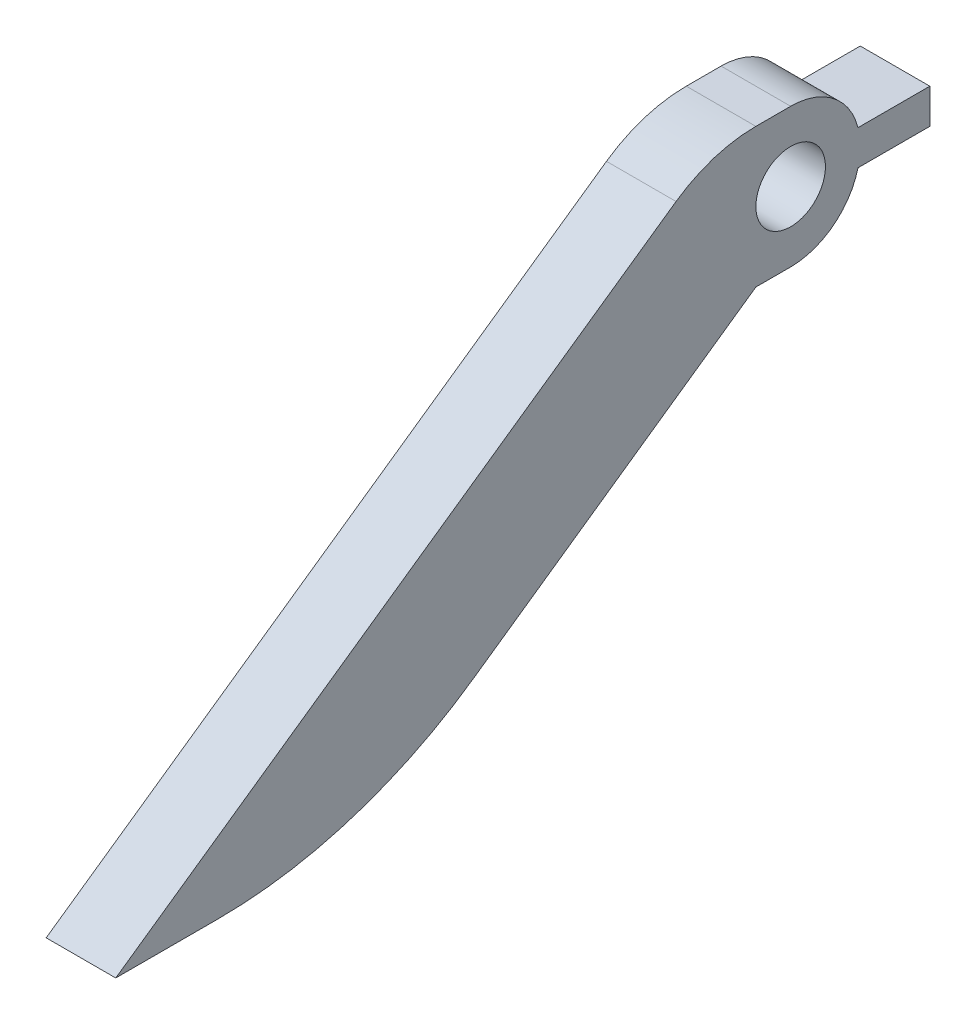
ISO-10303-21;
HEADER;
FILE_DESCRIPTION(('STEP AP214'),'2;1');
FILE_NAME('part.step','',(''),(''),'','','');
FILE_SCHEMA(('AUTOMOTIVE_DESIGN { 1 0 10303 214 1 1 1 1 }'));
ENDSEC;
DATA;
#1=APPLICATION_CONTEXT('core data for automotive mechanical design processes');
#2=APPLICATION_PROTOCOL_DEFINITION('international standard','automotive_design',2000,#1);
#3=PRODUCT_CONTEXT('',#1,'mechanical');
#4=PRODUCT('Part','Part','',(#3));
#5=PRODUCT_RELATED_PRODUCT_CATEGORY('part','',(#4));
#6=PRODUCT_DEFINITION_FORMATION('','',#4);
#7=PRODUCT_DEFINITION_CONTEXT('part definition',#1,'design');
#8=PRODUCT_DEFINITION('design','',#6,#7);
#9=PRODUCT_DEFINITION_SHAPE('','',#8);
#10=(LENGTH_UNIT() NAMED_UNIT(*) SI_UNIT(.MILLI.,.METRE.));
#11=(NAMED_UNIT(*) PLANE_ANGLE_UNIT() SI_UNIT($,.RADIAN.));
#12=(NAMED_UNIT(*) SI_UNIT($,.STERADIAN.) SOLID_ANGLE_UNIT());
#13=UNCERTAINTY_MEASURE_WITH_UNIT(LENGTH_MEASURE(1.E-05),#10,'distance_accuracy_value','');
#14=(GEOMETRIC_REPRESENTATION_CONTEXT(3) GLOBAL_UNCERTAINTY_ASSIGNED_CONTEXT((#13)) GLOBAL_UNIT_ASSIGNED_CONTEXT((#10,
#11,#12)) REPRESENTATION_CONTEXT('',''));
#15=CARTESIAN_POINT('',(0.,0.,0.));
#16=DIRECTION('',(0.,0.,1.));
#17=DIRECTION('',(1.,0.,0.));
#18=AXIS2_PLACEMENT_3D('',#15,#16,#17);
#19=CARTESIAN_POINT('',(6.35,25.4,-47.3458465234436));
#20=DIRECTION('',(-1.,0.,0.));
#21=DIRECTION('',(0.,0.,1.));
#22=AXIS2_PLACEMENT_3D('',#19,#20,#21);
#23=CYLINDRICAL_SURFACE('',#22,12.7);
#24=CARTESIAN_POINT('',(0.,25.4,-47.3458465234436));
#25=DIRECTION('',(1.,0.,0.));
#26=DIRECTION('',(0.,0.,-1.));
#27=AXIS2_PLACEMENT_3D('',#24,#25,#26);
#28=CIRCLE('',#27,12.7);
#29=CARTESIAN_POINT('',(0.,35.8032309624702,-40.0614257817853));
#30=VERTEX_POINT('',#29);
#31=CARTESIAN_POINT('',(0.,38.1,-47.3458465234436));
#32=VERTEX_POINT('',#31);
#33=EDGE_CURVE('E136',#30,#32,#28,.F.);
#34=ORIENTED_EDGE('',*,*,#33,.F.);
#35=DIRECTION('',(-1.,0.,0.));
#36=VECTOR('',#35,1.);
#37=CARTESIAN_POINT('',(6.35,35.8032309624702,-40.0614257817853));
#38=LINE('',#37,#36);
#39=CARTESIAN_POINT('',(6.35,35.8032309624702,-40.0614257817853));
#40=VERTEX_POINT('',#39);
#41=EDGE_CURVE('E131',#40,#30,#38,.T.);
#42=ORIENTED_EDGE('',*,*,#41,.F.);
#43=CARTESIAN_POINT('',(6.35,25.4,-47.3458465234436));
#44=DIRECTION('',(1.,0.,0.));
#45=DIRECTION('',(0.,0.,-1.));
#46=AXIS2_PLACEMENT_3D('',#43,#44,#45);
#47=CIRCLE('',#46,12.7);
#48=CARTESIAN_POINT('',(6.35,38.1,-47.3458465234436));
#49=VERTEX_POINT('',#48);
#50=EDGE_CURVE('E133',#40,#49,#47,.F.);
#51=ORIENTED_EDGE('',*,*,#50,.T.);
#52=DIRECTION('',(-1.,0.,0.));
#53=VECTOR('',#52,1.);
#54=CARTESIAN_POINT('',(6.35,38.1,-47.3458465234436));
#55=LINE('',#54,#53);
#56=EDGE_CURVE('E187',#49,#32,#55,.T.);
#57=ORIENTED_EDGE('',*,*,#56,.T.);
#58=EDGE_LOOP('',(#34,#42,#51,#57));
#59=FACE_BOUND('',#58,.T.);
#60=ADVANCED_FACE('F41',(#59),#23,.T.);
#61=CARTESIAN_POINT('',(6.35,5.2016154812351,3.64221037082915));
#62=DIRECTION('',(0.,0.819152044288991,0.573576436351047));
#63=DIRECTION('',(0.,-0.573576436351047,0.819152044288991));
#64=AXIS2_PLACEMENT_3D('',#61,#62,#63);
#65=PLANE('',#64);
#66=DIRECTION('',(0.,0.573576436351047,-0.819152044288991));
#67=VECTOR('',#66,1.);
#68=CARTESIAN_POINT('',(0.,5.2016154812351,3.64221037082915));
#69=LINE('',#68,#67);
#70=CARTESIAN_POINT('',(0.,0.,11.070887152194));
#71=VERTEX_POINT('',#70);
#72=EDGE_CURVE('E194',#71,#30,#69,.T.);
#73=ORIENTED_EDGE('',*,*,#72,.F.);
#74=DIRECTION('',(-1.,0.,0.));
#75=VECTOR('',#74,1.);
#76=CARTESIAN_POINT('',(6.35,0.,11.070887152194));
#77=LINE('',#76,#75);
#78=CARTESIAN_POINT('',(6.35,0.,11.070887152194));
#79=VERTEX_POINT('',#78);
#80=EDGE_CURVE('E143',#79,#71,#77,.T.);
#81=ORIENTED_EDGE('',*,*,#80,.F.);
#82=DIRECTION('',(0.,0.573576436351047,-0.819152044288991));
#83=VECTOR('',#82,1.);
#84=CARTESIAN_POINT('',(6.35,5.2016154812351,3.64221037082915));
#85=LINE('',#84,#83);
#86=EDGE_CURVE('E148',#79,#40,#85,.T.);
#87=ORIENTED_EDGE('',*,*,#86,.T.);
#88=ORIENTED_EDGE('',*,*,#41,.T.);
#89=EDGE_LOOP('',(#73,#81,#87,#88));
#90=FACE_BOUND('',#89,.T.);
#91=ADVANCED_FACE('F154',(#90),#65,.T.);
#92=CARTESIAN_POINT('',(6.35,0.,0.));
#93=DIRECTION('',(0.,1.,0.));
#94=DIRECTION('',(0.,0.,1.));
#95=AXIS2_PLACEMENT_3D('',#92,#93,#94);
#96=PLANE('',#95);
#97=DIRECTION('',(0.,0.,-1.));
#98=VECTOR('',#97,1.);
#99=CARTESIAN_POINT('',(0.,0.,0.));
#100=LINE('',#99,#98);
#101=CARTESIAN_POINT('',(0.,0.,1.74285562784797));
#102=VERTEX_POINT('',#101);
#103=EDGE_CURVE('E197',#71,#102,#100,.T.);
#104=ORIENTED_EDGE('',*,*,#103,.T.);
#105=DIRECTION('',(-1.,0.,0.));
#106=VECTOR('',#105,1.);
#107=CARTESIAN_POINT('',(6.35,0.,1.74285562784797));
#108=LINE('',#107,#106);
#109=CARTESIAN_POINT('',(6.35,0.,1.74285562784797));
#110=VERTEX_POINT('',#109);
#111=EDGE_CURVE('E50',#102,#110,#108,.F.);
#112=ORIENTED_EDGE('',*,*,#111,.T.);
#113=DIRECTION('',(0.,0.,-1.));
#114=VECTOR('',#113,1.);
#115=CARTESIAN_POINT('',(6.35,0.,0.));
#116=LINE('',#115,#114);
#117=EDGE_CURVE('E156',#79,#110,#116,.T.);
#118=ORIENTED_EDGE('',*,*,#117,.F.);
#119=ORIENTED_EDGE('',*,*,#80,.T.);
#120=EDGE_LOOP('',(#104,#112,#118,#119));
#121=FACE_BOUND('',#120,.T.);
#122=ADVANCED_FACE('F273',(#121),#96,.F.);
#123=CARTESIAN_POINT('',(6.35,-5.20161548123509,-3.64221037082915));
#124=DIRECTION('',(0.,0.819152044288991,0.573576436351047));
#125=DIRECTION('',(0.,-0.573576436351047,0.819152044288991));
#126=AXIS2_PLACEMENT_3D('',#123,#124,#125);
#127=PLANE('',#126);
#128=DIRECTION('',(0.,0.573576436351047,-0.819152044288991));
#129=VECTOR('',#128,1.);
#130=CARTESIAN_POINT('',(6.35,-5.20161548123509,-3.64221037082915));
#131=LINE('',#130,#129);
#132=CARTESIAN_POINT('',(6.35,7.3496609200954,-21.5672907454586));
#133=VERTEX_POINT('',#132);
#134=CARTESIAN_POINT('',(6.35,25.4,-47.3458465234436));
#135=VERTEX_POINT('',#134);
#136=EDGE_CURVE('E159',#133,#135,#131,.T.);
#137=ORIENTED_EDGE('',*,*,#136,.F.);
#138=DIRECTION('',(-1.,0.,0.));
#139=VECTOR('',#138,1.);
#140=CARTESIAN_POINT('',(6.35,7.3496609200954,-21.5672907454586));
#141=LINE('',#140,#139);
#142=CARTESIAN_POINT('',(0.,7.3496609200954,-21.5672907454586));
#143=VERTEX_POINT('',#142);
#144=EDGE_CURVE('E142',#133,#143,#141,.T.);
#145=ORIENTED_EDGE('',*,*,#144,.T.);
#146=DIRECTION('',(0.,0.573576436351047,-0.819152044288991));
#147=VECTOR('',#146,1.);
#148=CARTESIAN_POINT('',(0.,-5.20161548123509,-3.64221037082915));
#149=LINE('',#148,#147);
#150=CARTESIAN_POINT('',(0.,25.4,-47.3458465234436));
#151=VERTEX_POINT('',#150);
#152=EDGE_CURVE('E200',#143,#151,#149,.T.);
#153=ORIENTED_EDGE('',*,*,#152,.T.);
#154=DIRECTION('',(-1.,0.,0.));
#155=VECTOR('',#154,1.);
#156=CARTESIAN_POINT('',(6.35,25.4,-47.3458465234436));
#157=LINE('',#156,#155);
#158=EDGE_CURVE('E249',#135,#151,#157,.T.);
#159=ORIENTED_EDGE('',*,*,#158,.F.);
#160=EDGE_LOOP('',(#137,#145,#153,#159));
#161=FACE_BOUND('',#160,.T.);
#162=ADVANCED_FACE('F281',(#161),#127,.F.);
#163=CARTESIAN_POINT('',(6.35,25.4,0.));
#164=DIRECTION('',(0.,1.,0.));
#165=DIRECTION('',(0.,0.,1.));
#166=AXIS2_PLACEMENT_3D('',#163,#164,#165);
#167=PLANE('',#166);
#168=DIRECTION('',(0.,0.,-1.));
#169=VECTOR('',#168,1.);
#170=CARTESIAN_POINT('',(0.,25.4,0.));
#171=LINE('',#170,#169);
#172=CARTESIAN_POINT('',(0.,25.4,-50.5208465234436));
#173=VERTEX_POINT('',#172);
#174=EDGE_CURVE('E203',#151,#173,#171,.T.);
#175=ORIENTED_EDGE('',*,*,#174,.T.);
#176=DIRECTION('',(-1.,0.,0.));
#177=VECTOR('',#176,1.);
#178=CARTESIAN_POINT('',(6.35,25.4,-50.5208465234436));
#179=LINE('',#178,#177);
#180=CARTESIAN_POINT('',(6.35,25.4,-50.5208465234436));
#181=VERTEX_POINT('',#180);
#182=EDGE_CURVE('E245',#181,#173,#179,.T.);
#183=ORIENTED_EDGE('',*,*,#182,.F.);
#184=DIRECTION('',(0.,0.,-1.));
#185=VECTOR('',#184,1.);
#186=CARTESIAN_POINT('',(6.35,25.4,0.));
#187=LINE('',#186,#185);
#188=EDGE_CURVE('E165',#135,#181,#187,.T.);
#189=ORIENTED_EDGE('',*,*,#188,.F.);
#190=ORIENTED_EDGE('',*,*,#158,.T.);
#191=EDGE_LOOP('',(#175,#183,#189,#190));
#192=FACE_BOUND('',#191,.T.);
#193=ADVANCED_FACE('F284',(#192),#167,.F.);
#194=CARTESIAN_POINT('',(6.35,31.75,-50.5208465234436));
#195=DIRECTION('',(-1.,0.,0.));
#196=DIRECTION('',(0.,0.,1.));
#197=AXIS2_PLACEMENT_3D('',#194,#195,#196);
#198=CYLINDRICAL_SURFACE('',#197,6.35000000000001);
#199=CARTESIAN_POINT('',(0.,31.75,-50.5208465234436));
#200=DIRECTION('',(1.,0.,0.));
#201=DIRECTION('',(0.,0.,-1.));
#202=AXIS2_PLACEMENT_3D('',#199,#200,#201);
#203=CIRCLE('',#202,6.35000000000001);
#204=CARTESIAN_POINT('',(0.,30.1625,-56.6692075855478));
#205=VERTEX_POINT('',#204);
#206=EDGE_CURVE('E207',#173,#205,#203,.T.);
#207=ORIENTED_EDGE('',*,*,#206,.T.);
#208=DIRECTION('',(-1.,0.,0.));
#209=VECTOR('',#208,1.);
#210=CARTESIAN_POINT('',(6.35,30.1625,-56.6692075855478));
#211=LINE('',#210,#209);
#212=CARTESIAN_POINT('',(6.35,30.1625,-56.6692075855478));
#213=VERTEX_POINT('',#212);
#214=EDGE_CURVE('E242',#213,#205,#211,.T.);
#215=ORIENTED_EDGE('',*,*,#214,.F.);
#216=CARTESIAN_POINT('',(6.35,31.75,-50.5208465234436));
#217=DIRECTION('',(1.,0.,0.));
#218=DIRECTION('',(0.,0.,-1.));
#219=AXIS2_PLACEMENT_3D('',#216,#217,#218);
#220=CIRCLE('',#219,6.35000000000001);
#221=EDGE_CURVE('E169',#181,#213,#220,.T.);
#222=ORIENTED_EDGE('',*,*,#221,.F.);
#223=ORIENTED_EDGE('',*,*,#182,.T.);
#224=EDGE_LOOP('',(#207,#215,#222,#223));
#225=FACE_BOUND('',#224,.T.);
#226=ADVANCED_FACE('F289',(#225),#198,.T.);
#227=CARTESIAN_POINT('',(6.35,30.1625,0.));
#228=DIRECTION('',(0.,-1.,0.));
#229=DIRECTION('',(0.,0.,-1.));
#230=AXIS2_PLACEMENT_3D('',#227,#228,#229);
#231=PLANE('',#230);
#232=DIRECTION('',(0.,0.,1.));
#233=VECTOR('',#232,1.);
#234=CARTESIAN_POINT('',(0.,30.1625,0.));
#235=LINE('',#234,#233);
#236=CARTESIAN_POINT('',(0.,30.1625,-63.2208465234436));
#237=VERTEX_POINT('',#236);
#238=EDGE_CURVE('E211',#237,#205,#235,.T.);
#239=ORIENTED_EDGE('',*,*,#238,.F.);
#240=DIRECTION('',(-1.,0.,0.));
#241=VECTOR('',#240,1.);
#242=CARTESIAN_POINT('',(6.35,30.1625,-63.2208465234436));
#243=LINE('',#242,#241);
#244=CARTESIAN_POINT('',(6.35,30.1625,-63.2208465234436));
#245=VERTEX_POINT('',#244);
#246=EDGE_CURVE('E239',#245,#237,#243,.T.);
#247=ORIENTED_EDGE('',*,*,#246,.F.);
#248=DIRECTION('',(0.,0.,1.));
#249=VECTOR('',#248,1.);
#250=CARTESIAN_POINT('',(6.35,30.1625,0.));
#251=LINE('',#250,#249);
#252=EDGE_CURVE('E172',#245,#213,#251,.T.);
#253=ORIENTED_EDGE('',*,*,#252,.T.);
#254=ORIENTED_EDGE('',*,*,#214,.T.);
#255=EDGE_LOOP('',(#239,#247,#253,#254));
#256=FACE_BOUND('',#255,.T.);
#257=ADVANCED_FACE('F292',(#256),#231,.T.);
#258=CARTESIAN_POINT('',(6.35,0.,-63.2208465234436));
#259=DIRECTION('',(0.,0.,-1.));
#260=DIRECTION('',(-1.,0.,0.));
#261=AXIS2_PLACEMENT_3D('',#258,#259,#260);
#262=PLANE('',#261);
#263=DIRECTION('',(0.,-1.,0.));
#264=VECTOR('',#263,1.);
#265=CARTESIAN_POINT('',(0.,0.,-63.2208465234436));
#266=LINE('',#265,#264);
#267=CARTESIAN_POINT('',(0.,33.3375,-63.2208465234436));
#268=VERTEX_POINT('',#267);
#269=EDGE_CURVE('E216',#268,#237,#266,.T.);
#270=ORIENTED_EDGE('',*,*,#269,.F.);
#271=DIRECTION('',(-1.,0.,0.));
#272=VECTOR('',#271,1.);
#273=CARTESIAN_POINT('',(6.35,33.3375,-63.2208465234436));
#274=LINE('',#273,#272);
#275=CARTESIAN_POINT('',(6.35,33.3375,-63.2208465234436));
#276=VERTEX_POINT('',#275);
#277=EDGE_CURVE('E236',#276,#268,#274,.T.);
#278=ORIENTED_EDGE('',*,*,#277,.F.);
#279=DIRECTION('',(0.,-1.,0.));
#280=VECTOR('',#279,1.);
#281=CARTESIAN_POINT('',(6.35,0.,-63.2208465234436));
#282=LINE('',#281,#280);
#283=EDGE_CURVE('E177',#276,#245,#282,.T.);
#284=ORIENTED_EDGE('',*,*,#283,.T.);
#285=ORIENTED_EDGE('',*,*,#246,.T.);
#286=EDGE_LOOP('',(#270,#278,#284,#285));
#287=FACE_BOUND('',#286,.T.);
#288=ADVANCED_FACE('F295',(#287),#262,.T.);
#289=CARTESIAN_POINT('',(6.35,33.3375,0.));
#290=DIRECTION('',(0.,1.,0.));
#291=DIRECTION('',(0.,0.,1.));
#292=AXIS2_PLACEMENT_3D('',#289,#290,#291);
#293=PLANE('',#292);
#294=DIRECTION('',(0.,0.,-1.));
#295=VECTOR('',#294,1.);
#296=CARTESIAN_POINT('',(0.,33.3375,0.));
#297=LINE('',#296,#295);
#298=CARTESIAN_POINT('',(0.,33.3375,-56.6692075855479));
#299=VERTEX_POINT('',#298);
#300=EDGE_CURVE('E220',#299,#268,#297,.T.);
#301=ORIENTED_EDGE('',*,*,#300,.F.);
#302=DIRECTION('',(-1.,0.,0.));
#303=VECTOR('',#302,1.);
#304=CARTESIAN_POINT('',(6.35,33.3375,-56.6692075855479));
#305=LINE('',#304,#303);
#306=CARTESIAN_POINT('',(6.35,33.3375,-56.6692075855479));
#307=VERTEX_POINT('',#306);
#308=EDGE_CURVE('E233',#307,#299,#305,.T.);
#309=ORIENTED_EDGE('',*,*,#308,.F.);
#310=DIRECTION('',(0.,0.,-1.));
#311=VECTOR('',#310,1.);
#312=CARTESIAN_POINT('',(6.35,33.3375,0.));
#313=LINE('',#312,#311);
#314=EDGE_CURVE('E181',#307,#276,#313,.T.);
#315=ORIENTED_EDGE('',*,*,#314,.T.);
#316=ORIENTED_EDGE('',*,*,#277,.T.);
#317=EDGE_LOOP('',(#301,#309,#315,#316));
#318=FACE_BOUND('',#317,.T.);
#319=ADVANCED_FACE('F298',(#318),#293,.T.);
#320=CARTESIAN_POINT('',(0.,38.1,-50.5208465234436));
#321=VERTEX_POINT('',#320);
#322=EDGE_CURVE('E212',#299,#321,#203,.T.);
#323=ORIENTED_EDGE('',*,*,#322,.T.);
#324=DIRECTION('',(-1.,0.,0.));
#325=VECTOR('',#324,1.);
#326=CARTESIAN_POINT('',(6.35,38.1,-50.5208465234436));
#327=LINE('',#326,#325);
#328=CARTESIAN_POINT('',(6.35,38.1,-50.5208465234436));
#329=VERTEX_POINT('',#328);
#330=EDGE_CURVE('E230',#329,#321,#327,.T.);
#331=ORIENTED_EDGE('',*,*,#330,.F.);
#332=EDGE_CURVE('E173',#307,#329,#220,.T.);
#333=ORIENTED_EDGE('',*,*,#332,.F.);
#334=ORIENTED_EDGE('',*,*,#308,.T.);
#335=EDGE_LOOP('',(#323,#331,#333,#334));
#336=FACE_BOUND('',#335,.T.);
#337=ADVANCED_FACE('F267',(#336),#198,.T.);
#338=CARTESIAN_POINT('',(6.35,31.75,-50.5208465234436));
#339=DIRECTION('',(-1.,0.,0.));
#340=DIRECTION('',(0.,0.,1.));
#341=AXIS2_PLACEMENT_3D('',#338,#339,#340);
#342=CYLINDRICAL_SURFACE('',#341,3.175);
#343=CARTESIAN_POINT('',(6.35,31.75,-50.5208465234436));
#344=DIRECTION('',(1.,0.,0.));
#345=DIRECTION('',(0.,0.,-1.));
#346=AXIS2_PLACEMENT_3D('',#343,#344,#345);
#347=CIRCLE('',#346,3.175);
#348=CARTESIAN_POINT('',(6.35,31.75,-53.6958465234436));
#349=VERTEX_POINT('',#348);
#350=EDGE_CURVE('E152',#349,#349,#347,.T.);
#351=ORIENTED_EDGE('',*,*,#350,.T.);
#352=EDGE_LOOP('',(#351));
#353=FACE_BOUND('',#352,.T.);
#354=CARTESIAN_POINT('',(0.,31.75,-50.5208465234436));
#355=DIRECTION('',(1.,0.,0.));
#356=DIRECTION('',(0.,0.,-1.));
#357=AXIS2_PLACEMENT_3D('',#354,#355,#356);
#358=CIRCLE('',#357,3.175);
#359=CARTESIAN_POINT('',(0.,31.75,-53.6958465234436));
#360=VERTEX_POINT('',#359);
#361=EDGE_CURVE('E188',#360,#360,#358,.T.);
#362=ORIENTED_EDGE('',*,*,#361,.F.);
#363=EDGE_LOOP('',(#362));
#364=FACE_BOUND('',#363,.T.);
#365=ADVANCED_FACE('F304',(#353,#364),#342,.F.);
#366=CARTESIAN_POINT('',(6.35,38.0999999999996,3.33066907387547E-13));
#367=DIRECTION('',(0.,1.,0.));
#368=DIRECTION('',(0.,0.,1.));
#369=AXIS2_PLACEMENT_3D('',#366,#367,#368);
#370=PLANE('',#369);
#371=DIRECTION('',(0.,0.,-1.));
#372=VECTOR('',#371,1.);
#373=CARTESIAN_POINT('',(0.,38.0999999999996,3.33066907387547E-13));
#374=LINE('',#373,#372);
#375=EDGE_CURVE('E224',#32,#321,#374,.T.);
#376=ORIENTED_EDGE('',*,*,#375,.F.);
#377=ORIENTED_EDGE('',*,*,#56,.F.);
#378=DIRECTION('',(0.,0.,-1.));
#379=VECTOR('',#378,1.);
#380=CARTESIAN_POINT('',(6.35,38.0999999999996,3.33066907387547E-13));
#381=LINE('',#380,#379);
#382=EDGE_CURVE('E150',#49,#329,#381,.T.);
#383=ORIENTED_EDGE('',*,*,#382,.T.);
#384=ORIENTED_EDGE('',*,*,#330,.T.);
#385=EDGE_LOOP('',(#376,#377,#383,#384));
#386=FACE_BOUND('',#385,.T.);
#387=ADVANCED_FACE('F271',(#386),#370,.T.);
#388=CARTESIAN_POINT('',(6.35,0.,0.));
#389=DIRECTION('',(1.,0.,0.));
#390=DIRECTION('',(0.,0.,-1.));
#391=AXIS2_PLACEMENT_3D('',#388,#389,#390);
#392=PLANE('',#391);
#393=ORIENTED_EDGE('',*,*,#350,.F.);
#394=EDGE_LOOP('',(#393));
#395=FACE_BOUND('',#394,.T.);
#396=ORIENTED_EDGE('',*,*,#117,.T.);
#397=CARTESIAN_POINT('',(6.35,40.64,1.74285562784797));
#398=DIRECTION('',(1.,0.,0.));
#399=DIRECTION('',(0.,0.,-1.));
#400=AXIS2_PLACEMENT_3D('',#397,#398,#399);
#401=CIRCLE('',#400,40.64);
#402=EDGE_CURVE('E11',#110,#133,#401,.T.);
#403=ORIENTED_EDGE('',*,*,#402,.T.);
#404=ORIENTED_EDGE('',*,*,#136,.T.);
#405=ORIENTED_EDGE('',*,*,#188,.T.);
#406=ORIENTED_EDGE('',*,*,#221,.T.);
#407=ORIENTED_EDGE('',*,*,#252,.F.);
#408=ORIENTED_EDGE('',*,*,#283,.F.);
#409=ORIENTED_EDGE('',*,*,#314,.F.);
#410=ORIENTED_EDGE('',*,*,#332,.T.);
#411=ORIENTED_EDGE('',*,*,#382,.F.);
#412=ORIENTED_EDGE('',*,*,#50,.F.);
#413=ORIENTED_EDGE('',*,*,#86,.F.);
#414=EDGE_LOOP('',(#396,#403,#404,#405,#406,#407,#408,#409,#410,#411,#412,#413));
#415=FACE_BOUND('',#414,.T.);
#416=ADVANCED_FACE('F147',(#395,#415),#392,.T.);
#417=CARTESIAN_POINT('',(0.,0.,0.));
#418=DIRECTION('',(1.,0.,0.));
#419=DIRECTION('',(0.,0.,-1.));
#420=AXIS2_PLACEMENT_3D('',#417,#418,#419);
#421=PLANE('',#420);
#422=ORIENTED_EDGE('',*,*,#361,.T.);
#423=EDGE_LOOP('',(#422));
#424=FACE_BOUND('',#423,.T.);
#425=ORIENTED_EDGE('',*,*,#152,.F.);
#426=CARTESIAN_POINT('',(0.,40.64,1.74285562784797));
#427=DIRECTION('',(1.,0.,0.));
#428=DIRECTION('',(0.,0.,-1.));
#429=AXIS2_PLACEMENT_3D('',#426,#427,#428);
#430=CIRCLE('',#429,40.64);
#431=EDGE_CURVE('E64',#143,#102,#430,.F.);
#432=ORIENTED_EDGE('',*,*,#431,.T.);
#433=ORIENTED_EDGE('',*,*,#103,.F.);
#434=ORIENTED_EDGE('',*,*,#72,.T.);
#435=ORIENTED_EDGE('',*,*,#33,.T.);
#436=ORIENTED_EDGE('',*,*,#375,.T.);
#437=ORIENTED_EDGE('',*,*,#322,.F.);
#438=ORIENTED_EDGE('',*,*,#300,.T.);
#439=ORIENTED_EDGE('',*,*,#269,.T.);
#440=ORIENTED_EDGE('',*,*,#238,.T.);
#441=ORIENTED_EDGE('',*,*,#206,.F.);
#442=ORIENTED_EDGE('',*,*,#174,.F.);
#443=EDGE_LOOP('',(#425,#432,#433,#434,#435,#436,#437,#438,#439,#440,#441,#442));
#444=FACE_BOUND('',#443,.T.);
#445=ADVANCED_FACE('F272',(#424,#444),#421,.F.);
#446=CARTESIAN_POINT('',(6.35,40.64,1.74285562784797));
#447=DIRECTION('',(-1.,0.,0.));
#448=DIRECTION('',(0.,0.,1.));
#449=AXIS2_PLACEMENT_3D('',#446,#447,#448);
#450=CYLINDRICAL_SURFACE('',#449,40.64);
#451=ORIENTED_EDGE('',*,*,#402,.F.);
#452=ORIENTED_EDGE('',*,*,#111,.F.);
#453=ORIENTED_EDGE('',*,*,#431,.F.);
#454=ORIENTED_EDGE('',*,*,#144,.F.);
#455=EDGE_LOOP('',(#451,#452,#453,#454));
#456=FACE_BOUND('',#455,.T.);
#457=ADVANCED_FACE('F43',(#456),#450,.T.);
#458=CLOSED_SHELL('',(#60,#91,#122,#162,#193,#226,#257,#288,#319,#337,#365,#387,#416,#445,#457));
#459=MANIFOLD_SOLID_BREP('B2',#458);
#460=ADVANCED_BREP_SHAPE_REPRESENTATION('',(#18,#459),#14);
#461=SHAPE_DEFINITION_REPRESENTATION(#9,#460);
ENDSEC;
END-ISO-10303-21;
